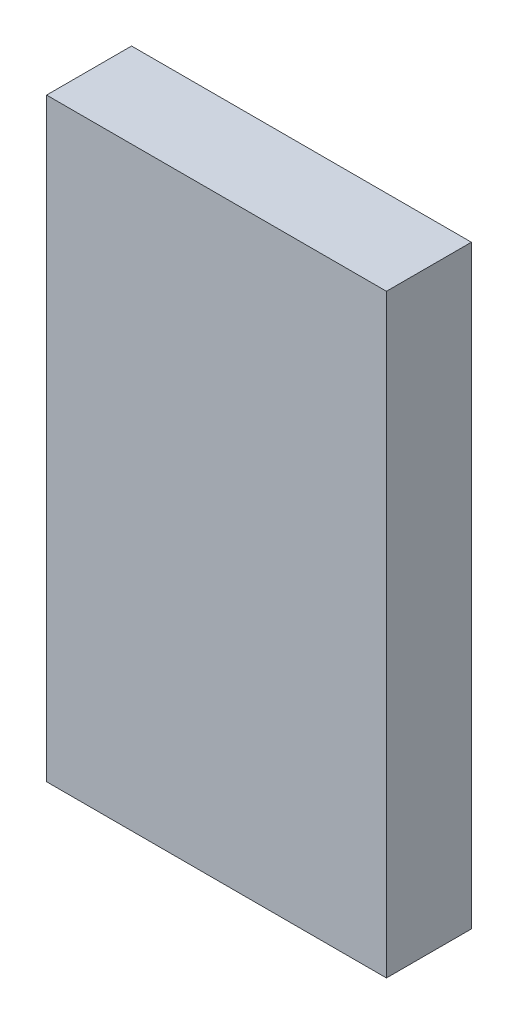
ISO-10303-21;
HEADER;
FILE_DESCRIPTION(('STEP AP214'),'2;1');
FILE_NAME('part.step','',(''),(''),'','','');
FILE_SCHEMA(('AUTOMOTIVE_DESIGN { 1 0 10303 214 1 1 1 1 }'));
ENDSEC;
DATA;
#1=APPLICATION_CONTEXT('core data for automotive mechanical design processes');
#2=APPLICATION_PROTOCOL_DEFINITION('international standard','automotive_design',2000,#1);
#3=PRODUCT_CONTEXT('',#1,'mechanical');
#4=PRODUCT('Part','Part','',(#3));
#5=PRODUCT_RELATED_PRODUCT_CATEGORY('part','',(#4));
#6=PRODUCT_DEFINITION_FORMATION('','',#4);
#7=PRODUCT_DEFINITION_CONTEXT('part definition',#1,'design');
#8=PRODUCT_DEFINITION('design','',#6,#7);
#9=PRODUCT_DEFINITION_SHAPE('','',#8);
#10=(LENGTH_UNIT() NAMED_UNIT(*) SI_UNIT(.MILLI.,.METRE.));
#11=(NAMED_UNIT(*) PLANE_ANGLE_UNIT() SI_UNIT($,.RADIAN.));
#12=(NAMED_UNIT(*) SI_UNIT($,.STERADIAN.) SOLID_ANGLE_UNIT());
#13=UNCERTAINTY_MEASURE_WITH_UNIT(LENGTH_MEASURE(1.E-05),#10,'distance_accuracy_value','');
#14=(GEOMETRIC_REPRESENTATION_CONTEXT(3) GLOBAL_UNCERTAINTY_ASSIGNED_CONTEXT((#13)) GLOBAL_UNIT_ASSIGNED_CONTEXT((#10,
#11,#12)) REPRESENTATION_CONTEXT('',''));
#15=CARTESIAN_POINT('',(0.,0.,0.));
#16=DIRECTION('',(0.,0.,1.));
#17=DIRECTION('',(1.,0.,0.));
#18=AXIS2_PLACEMENT_3D('',#15,#16,#17);
#19=CARTESIAN_POINT('',(12.7,-22.225,6.35));
#20=DIRECTION('',(-1.,0.,0.));
#21=DIRECTION('',(0.,0.,1.));
#22=AXIS2_PLACEMENT_3D('',#19,#20,#21);
#23=PLANE('',#22);
#24=DIRECTION('',(0.,1.,0.));
#25=VECTOR('',#24,1.);
#26=CARTESIAN_POINT('',(12.7,-22.225,0.));
#27=LINE('',#26,#25);
#28=CARTESIAN_POINT('',(12.7,-22.225,0.));
#29=VERTEX_POINT('',#28);
#30=CARTESIAN_POINT('',(12.7,22.225,0.));
#31=VERTEX_POINT('',#30);
#32=EDGE_CURVE('E96',#29,#31,#27,.T.);
#33=ORIENTED_EDGE('',*,*,#32,.T.);
#34=DIRECTION('',(0.,0.,-1.));
#35=VECTOR('',#34,1.);
#36=CARTESIAN_POINT('',(12.7,22.225,6.35));
#37=LINE('',#36,#35);
#38=CARTESIAN_POINT('',(12.7,22.225,6.35));
#39=VERTEX_POINT('',#38);
#40=EDGE_CURVE('E11',#39,#31,#37,.T.);
#41=ORIENTED_EDGE('',*,*,#40,.F.);
#42=DIRECTION('',(0.,1.,0.));
#43=VECTOR('',#42,1.);
#44=CARTESIAN_POINT('',(12.7,-22.225,6.35));
#45=LINE('',#44,#43);
#46=CARTESIAN_POINT('',(12.7,-22.225,6.35));
#47=VERTEX_POINT('',#46);
#48=EDGE_CURVE('E84',#47,#39,#45,.T.);
#49=ORIENTED_EDGE('',*,*,#48,.F.);
#50=DIRECTION('',(0.,0.,-1.));
#51=VECTOR('',#50,1.);
#52=CARTESIAN_POINT('',(12.7,-22.225,6.35));
#53=LINE('',#52,#51);
#54=EDGE_CURVE('E92',#47,#29,#53,.T.);
#55=ORIENTED_EDGE('',*,*,#54,.T.);
#56=EDGE_LOOP('',(#33,#41,#49,#55));
#57=FACE_BOUND('',#56,.T.);
#58=ADVANCED_FACE('F33',(#57),#23,.F.);
#59=CARTESIAN_POINT('',(-12.7,22.225,6.35));
#60=DIRECTION('',(0.,-1.,0.));
#61=DIRECTION('',(0.,0.,-1.));
#62=AXIS2_PLACEMENT_3D('',#59,#60,#61);
#63=PLANE('',#62);
#64=DIRECTION('',(-1.,0.,0.));
#65=VECTOR('',#64,1.);
#66=CARTESIAN_POINT('',(-12.7,22.225,0.));
#67=LINE('',#66,#65);
#68=CARTESIAN_POINT('',(-12.7,22.225,0.));
#69=VERTEX_POINT('',#68);
#70=EDGE_CURVE('E88',#31,#69,#67,.T.);
#71=ORIENTED_EDGE('',*,*,#70,.T.);
#72=DIRECTION('',(0.,0.,-1.));
#73=VECTOR('',#72,1.);
#74=CARTESIAN_POINT('',(-12.7,22.225,6.35));
#75=LINE('',#74,#73);
#76=CARTESIAN_POINT('',(-12.7,22.225,6.35));
#77=VERTEX_POINT('',#76);
#78=EDGE_CURVE('E41',#77,#69,#75,.T.);
#79=ORIENTED_EDGE('',*,*,#78,.F.);
#80=DIRECTION('',(-1.,0.,0.));
#81=VECTOR('',#80,1.);
#82=CARTESIAN_POINT('',(-12.7,22.225,6.35));
#83=LINE('',#82,#81);
#84=EDGE_CURVE('E79',#39,#77,#83,.T.);
#85=ORIENTED_EDGE('',*,*,#84,.F.);
#86=ORIENTED_EDGE('',*,*,#40,.T.);
#87=EDGE_LOOP('',(#71,#79,#85,#86));
#88=FACE_BOUND('',#87,.T.);
#89=ADVANCED_FACE('F87',(#88),#63,.F.);
#90=CARTESIAN_POINT('',(-12.7,-22.225,6.35));
#91=DIRECTION('',(1.,0.,0.));
#92=DIRECTION('',(0.,0.,-1.));
#93=AXIS2_PLACEMENT_3D('',#90,#91,#92);
#94=PLANE('',#93);
#95=DIRECTION('',(0.,-1.,0.));
#96=VECTOR('',#95,1.);
#97=CARTESIAN_POINT('',(-12.7,-22.225,0.));
#98=LINE('',#97,#96);
#99=CARTESIAN_POINT('',(-12.7,-22.225,0.));
#100=VERTEX_POINT('',#99);
#101=EDGE_CURVE('E66',#69,#100,#98,.T.);
#102=ORIENTED_EDGE('',*,*,#101,.T.);
#103=DIRECTION('',(0.,0.,-1.));
#104=VECTOR('',#103,1.);
#105=CARTESIAN_POINT('',(-12.7,-22.225,6.35));
#106=LINE('',#105,#104);
#107=CARTESIAN_POINT('',(-12.7,-22.225,6.35));
#108=VERTEX_POINT('',#107);
#109=EDGE_CURVE('E89',#108,#100,#106,.T.);
#110=ORIENTED_EDGE('',*,*,#109,.F.);
#111=DIRECTION('',(0.,-1.,0.));
#112=VECTOR('',#111,1.);
#113=CARTESIAN_POINT('',(-12.7,-22.225,6.35));
#114=LINE('',#113,#112);
#115=EDGE_CURVE('E82',#77,#108,#114,.T.);
#116=ORIENTED_EDGE('',*,*,#115,.F.);
#117=ORIENTED_EDGE('',*,*,#78,.T.);
#118=EDGE_LOOP('',(#102,#110,#116,#117));
#119=FACE_BOUND('',#118,.T.);
#120=ADVANCED_FACE('F90',(#119),#94,.F.);
#121=CARTESIAN_POINT('',(-12.7,-22.225,6.35));
#122=DIRECTION('',(0.,1.,0.));
#123=DIRECTION('',(0.,0.,1.));
#124=AXIS2_PLACEMENT_3D('',#121,#122,#123);
#125=PLANE('',#124);
#126=DIRECTION('',(1.,0.,0.));
#127=VECTOR('',#126,1.);
#128=CARTESIAN_POINT('',(-12.7,-22.225,0.));
#129=LINE('',#128,#127);
#130=EDGE_CURVE('E72',#100,#29,#129,.T.);
#131=ORIENTED_EDGE('',*,*,#130,.T.);
#132=ORIENTED_EDGE('',*,*,#54,.F.);
#133=DIRECTION('',(1.,0.,0.));
#134=VECTOR('',#133,1.);
#135=CARTESIAN_POINT('',(-12.7,-22.225,6.35));
#136=LINE('',#135,#134);
#137=EDGE_CURVE('E49',#108,#47,#136,.T.);
#138=ORIENTED_EDGE('',*,*,#137,.F.);
#139=ORIENTED_EDGE('',*,*,#109,.T.);
#140=EDGE_LOOP('',(#131,#132,#138,#139));
#141=FACE_BOUND('',#140,.T.);
#142=ADVANCED_FACE('F103',(#141),#125,.F.);
#143=CARTESIAN_POINT('',(12.7,22.225,6.35));
#144=DIRECTION('',(0.,0.,-1.));
#145=DIRECTION('',(-1.,0.,0.));
#146=AXIS2_PLACEMENT_3D('',#143,#144,#145);
#147=PLANE('',#146);
#148=ORIENTED_EDGE('',*,*,#48,.T.);
#149=ORIENTED_EDGE('',*,*,#84,.T.);
#150=ORIENTED_EDGE('',*,*,#115,.T.);
#151=ORIENTED_EDGE('',*,*,#137,.T.);
#152=EDGE_LOOP('',(#148,#149,#150,#151));
#153=FACE_BOUND('',#152,.T.);
#154=ADVANCED_FACE('F80',(#153),#147,.F.);
#155=CARTESIAN_POINT('',(12.7,22.225,0.));
#156=DIRECTION('',(0.,0.,-1.));
#157=DIRECTION('',(-1.,0.,0.));
#158=AXIS2_PLACEMENT_3D('',#155,#156,#157);
#159=PLANE('',#158);
#160=ORIENTED_EDGE('',*,*,#32,.F.);
#161=ORIENTED_EDGE('',*,*,#130,.F.);
#162=ORIENTED_EDGE('',*,*,#101,.F.);
#163=ORIENTED_EDGE('',*,*,#70,.F.);
#164=EDGE_LOOP('',(#160,#161,#162,#163));
#165=FACE_BOUND('',#164,.T.);
#166=ADVANCED_FACE('F106',(#165),#159,.T.);
#167=CLOSED_SHELL('',(#58,#89,#120,#142,#154,#166));
#168=MANIFOLD_SOLID_BREP('B2',#167);
#169=ADVANCED_BREP_SHAPE_REPRESENTATION('',(#18,#168),#14);
#170=SHAPE_DEFINITION_REPRESENTATION(#9,#169);
ENDSEC;
END-ISO-10303-21;
